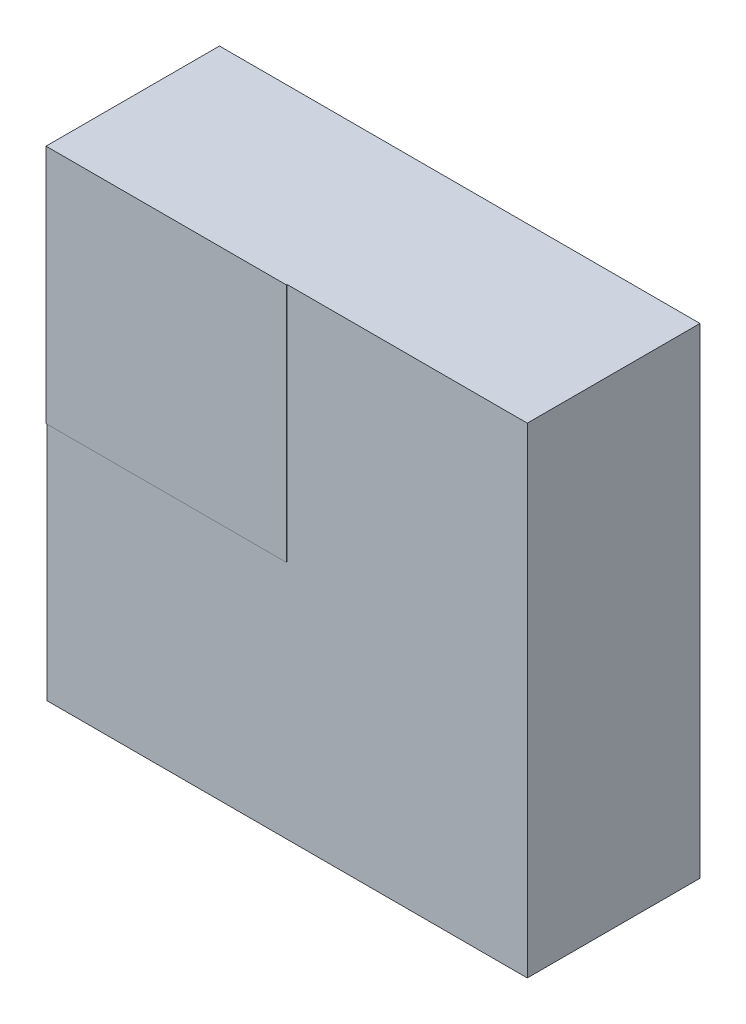
ISO-10303-21;
HEADER;
FILE_DESCRIPTION(('STEP AP214'),'2;1');
FILE_NAME('part.step','',(''),(''),'','','');
FILE_SCHEMA(('AUTOMOTIVE_DESIGN { 1 0 10303 214 1 1 1 1 }'));
ENDSEC;
DATA;
#1=APPLICATION_CONTEXT('core data for automotive mechanical design processes');
#2=APPLICATION_PROTOCOL_DEFINITION('international standard','automotive_design',2000,#1);
#3=PRODUCT_CONTEXT('',#1,'mechanical');
#4=PRODUCT('Part','Part','',(#3));
#5=PRODUCT_RELATED_PRODUCT_CATEGORY('part','',(#4));
#6=PRODUCT_DEFINITION_FORMATION('','',#4);
#7=PRODUCT_DEFINITION_CONTEXT('part definition',#1,'design');
#8=PRODUCT_DEFINITION('design','',#6,#7);
#9=PRODUCT_DEFINITION_SHAPE('','',#8);
#10=(LENGTH_UNIT() NAMED_UNIT(*) SI_UNIT(.MILLI.,.METRE.));
#11=(NAMED_UNIT(*) PLANE_ANGLE_UNIT() SI_UNIT($,.RADIAN.));
#12=(NAMED_UNIT(*) SI_UNIT($,.STERADIAN.) SOLID_ANGLE_UNIT());
#13=UNCERTAINTY_MEASURE_WITH_UNIT(LENGTH_MEASURE(1.E-05),#10,'distance_accuracy_value','');
#14=(GEOMETRIC_REPRESENTATION_CONTEXT(3) GLOBAL_UNCERTAINTY_ASSIGNED_CONTEXT((#13)) GLOBAL_UNIT_ASSIGNED_CONTEXT((#10,
#11,#12)) REPRESENTATION_CONTEXT('',''));
#15=CARTESIAN_POINT('',(0.,0.,0.));
#16=DIRECTION('',(0.,0.,1.));
#17=DIRECTION('',(1.,0.,0.));
#18=AXIS2_PLACEMENT_3D('',#15,#16,#17);
#19=CARTESIAN_POINT('',(0.,0.,0.23));
#20=DIRECTION('',(0.,0.,-1.));
#21=DIRECTION('',(-1.,0.,0.));
#22=AXIS2_PLACEMENT_3D('',#19,#20,#21);
#23=PLANE('',#22);
#24=DIRECTION('',(0.,1.,0.));
#25=VECTOR('',#24,1.);
#26=CARTESIAN_POINT('',(0.,0.32,0.23));
#27=LINE('',#26,#25);
#28=CARTESIAN_POINT('',(0.,0.,0.23));
#29=VERTEX_POINT('',#28);
#30=CARTESIAN_POINT('',(0.,0.32,0.23));
#31=VERTEX_POINT('',#30);
#32=EDGE_CURVE('E133',#29,#31,#27,.T.);
#33=ORIENTED_EDGE('',*,*,#32,.F.);
#34=DIRECTION('',(1.,0.,0.));
#35=VECTOR('',#34,1.);
#36=CARTESIAN_POINT('',(-0.32,0.,0.23));
#37=LINE('',#36,#35);
#38=CARTESIAN_POINT('',(-0.32,0.,0.23));
#39=VERTEX_POINT('',#38);
#40=EDGE_CURVE('E69',#39,#29,#37,.T.);
#41=ORIENTED_EDGE('',*,*,#40,.F.);
#42=DIRECTION('',(0.,-1.,0.));
#43=VECTOR('',#42,1.);
#44=CARTESIAN_POINT('',(-0.32,-0.32,0.23));
#45=LINE('',#44,#43);
#46=CARTESIAN_POINT('',(-0.32,-0.32,0.23));
#47=VERTEX_POINT('',#46);
#48=EDGE_CURVE('E137',#39,#47,#45,.T.);
#49=ORIENTED_EDGE('',*,*,#48,.T.);
#50=DIRECTION('',(1.,0.,0.));
#51=VECTOR('',#50,1.);
#52=CARTESIAN_POINT('',(-0.32,-0.32,0.23));
#53=LINE('',#52,#51);
#54=CARTESIAN_POINT('',(0.32,-0.32,0.23));
#55=VERTEX_POINT('',#54);
#56=EDGE_CURVE('E158',#47,#55,#53,.T.);
#57=ORIENTED_EDGE('',*,*,#56,.T.);
#58=DIRECTION('',(0.,1.,0.));
#59=VECTOR('',#58,1.);
#60=CARTESIAN_POINT('',(0.32,-0.32,0.23));
#61=LINE('',#60,#59);
#62=CARTESIAN_POINT('',(0.32,0.32,0.23));
#63=VERTEX_POINT('',#62);
#64=EDGE_CURVE('E150',#55,#63,#61,.T.);
#65=ORIENTED_EDGE('',*,*,#64,.T.);
#66=DIRECTION('',(-1.,0.,0.));
#67=VECTOR('',#66,1.);
#68=CARTESIAN_POINT('',(-0.32,0.32,0.23));
#69=LINE('',#68,#67);
#70=EDGE_CURVE('E75',#63,#31,#69,.T.);
#71=ORIENTED_EDGE('',*,*,#70,.T.);
#72=EDGE_LOOP('',(#33,#41,#49,#57,#65,#71));
#73=FACE_BOUND('',#72,.T.);
#74=ADVANCED_FACE('F46',(#73),#23,.F.);
#75=CARTESIAN_POINT('',(0.32,-0.32,0.23));
#76=DIRECTION('',(-1.,0.,0.));
#77=DIRECTION('',(0.,0.,1.));
#78=AXIS2_PLACEMENT_3D('',#75,#76,#77);
#79=PLANE('',#78);
#80=DIRECTION('',(0.,1.,0.));
#81=VECTOR('',#80,1.);
#82=CARTESIAN_POINT('',(0.32,-0.32,0.));
#83=LINE('',#82,#81);
#84=CARTESIAN_POINT('',(0.32,-0.32,0.));
#85=VERTEX_POINT('',#84);
#86=CARTESIAN_POINT('',(0.32,0.32,0.));
#87=VERTEX_POINT('',#86);
#88=EDGE_CURVE('E139',#85,#87,#83,.T.);
#89=ORIENTED_EDGE('',*,*,#88,.T.);
#90=DIRECTION('',(0.,0.,-1.));
#91=VECTOR('',#90,1.);
#92=CARTESIAN_POINT('',(0.32,0.32,0.23));
#93=LINE('',#92,#91);
#94=EDGE_CURVE('E179',#63,#87,#93,.T.);
#95=ORIENTED_EDGE('',*,*,#94,.F.);
#96=ORIENTED_EDGE('',*,*,#64,.F.);
#97=DIRECTION('',(0.,0.,-1.));
#98=VECTOR('',#97,1.);
#99=CARTESIAN_POINT('',(0.32,-0.32,0.23));
#100=LINE('',#99,#98);
#101=EDGE_CURVE('E160',#55,#85,#100,.T.);
#102=ORIENTED_EDGE('',*,*,#101,.T.);
#103=EDGE_LOOP('',(#89,#95,#96,#102));
#104=FACE_BOUND('',#103,.T.);
#105=ADVANCED_FACE('F216',(#104),#79,.F.);
#106=CARTESIAN_POINT('',(-0.32,0.32,0.23));
#107=DIRECTION('',(0.,-1.,0.));
#108=DIRECTION('',(0.,0.,-1.));
#109=AXIS2_PLACEMENT_3D('',#106,#107,#108);
#110=PLANE('',#109);
#111=DIRECTION('',(-1.,0.,0.));
#112=VECTOR('',#111,1.);
#113=CARTESIAN_POINT('',(-0.32,0.32,0.));
#114=LINE('',#113,#112);
#115=CARTESIAN_POINT('',(-0.32,0.32,0.));
#116=VERTEX_POINT('',#115);
#117=EDGE_CURVE('E144',#87,#116,#114,.T.);
#118=ORIENTED_EDGE('',*,*,#117,.T.);
#119=DIRECTION('',(0.,0.,-1.));
#120=VECTOR('',#119,1.);
#121=CARTESIAN_POINT('',(-0.32,0.32,0.23));
#122=LINE('',#121,#120);
#123=CARTESIAN_POINT('',(-0.32,0.32,0.231));
#124=VERTEX_POINT('',#123);
#125=EDGE_CURVE('E176',#124,#116,#122,.T.);
#126=ORIENTED_EDGE('',*,*,#125,.F.);
#127=DIRECTION('',(-1.,0.,0.));
#128=VECTOR('',#127,1.);
#129=CARTESIAN_POINT('',(-0.32,0.32,0.231));
#130=LINE('',#129,#128);
#131=CARTESIAN_POINT('',(0.,0.32,0.231));
#132=VERTEX_POINT('',#131);
#133=EDGE_CURVE('E129',#132,#124,#130,.T.);
#134=ORIENTED_EDGE('',*,*,#133,.F.);
#135=DIRECTION('',(0.,0.,-1.));
#136=VECTOR('',#135,1.);
#137=CARTESIAN_POINT('',(0.,0.32,0.231));
#138=LINE('',#137,#136);
#139=EDGE_CURVE('E146',#132,#31,#138,.T.);
#140=ORIENTED_EDGE('',*,*,#139,.T.);
#141=ORIENTED_EDGE('',*,*,#70,.F.);
#142=ORIENTED_EDGE('',*,*,#94,.T.);
#143=EDGE_LOOP('',(#118,#126,#134,#140,#141,#142));
#144=FACE_BOUND('',#143,.T.);
#145=ADVANCED_FACE('F410',(#144),#110,.F.);
#146=CARTESIAN_POINT('',(-0.32,-0.32,0.23));
#147=DIRECTION('',(1.,0.,0.));
#148=DIRECTION('',(0.,0.,-1.));
#149=AXIS2_PLACEMENT_3D('',#146,#147,#148);
#150=PLANE('',#149);
#151=DIRECTION('',(0.,-1.,0.));
#152=VECTOR('',#151,1.);
#153=CARTESIAN_POINT('',(-0.32,-0.32,0.));
#154=LINE('',#153,#152);
#155=CARTESIAN_POINT('',(-0.32,-0.32,0.));
#156=VERTEX_POINT('',#155);
#157=EDGE_CURVE('E164',#116,#156,#154,.T.);
#158=ORIENTED_EDGE('',*,*,#157,.T.);
#159=DIRECTION('',(0.,0.,-1.));
#160=VECTOR('',#159,1.);
#161=CARTESIAN_POINT('',(-0.32,-0.32,0.23));
#162=LINE('',#161,#160);
#163=EDGE_CURVE('E172',#47,#156,#162,.T.);
#164=ORIENTED_EDGE('',*,*,#163,.F.);
#165=ORIENTED_EDGE('',*,*,#48,.F.);
#166=DIRECTION('',(0.,0.,-1.));
#167=VECTOR('',#166,1.);
#168=CARTESIAN_POINT('',(-0.32,0.,0.231));
#169=LINE('',#168,#167);
#170=CARTESIAN_POINT('',(-0.32,0.,0.231));
#171=VERTEX_POINT('',#170);
#172=EDGE_CURVE('E116',#171,#39,#169,.T.);
#173=ORIENTED_EDGE('',*,*,#172,.F.);
#174=DIRECTION('',(0.,-1.,0.));
#175=VECTOR('',#174,1.);
#176=CARTESIAN_POINT('',(-0.32,0.32,0.231));
#177=LINE('',#176,#175);
#178=EDGE_CURVE('E123',#124,#171,#177,.T.);
#179=ORIENTED_EDGE('',*,*,#178,.F.);
#180=ORIENTED_EDGE('',*,*,#125,.T.);
#181=EDGE_LOOP('',(#158,#164,#165,#173,#179,#180));
#182=FACE_BOUND('',#181,.T.);
#183=ADVANCED_FACE('F135',(#182),#150,.F.);
#184=CARTESIAN_POINT('',(-0.32,-0.32,0.23));
#185=DIRECTION('',(0.,1.,0.));
#186=DIRECTION('',(0.,0.,1.));
#187=AXIS2_PLACEMENT_3D('',#184,#185,#186);
#188=PLANE('',#187);
#189=DIRECTION('',(1.,0.,0.));
#190=VECTOR('',#189,1.);
#191=CARTESIAN_POINT('',(-0.32,-0.32,0.));
#192=LINE('',#191,#190);
#193=EDGE_CURVE('E153',#156,#85,#192,.T.);
#194=ORIENTED_EDGE('',*,*,#193,.T.);
#195=ORIENTED_EDGE('',*,*,#101,.F.);
#196=ORIENTED_EDGE('',*,*,#56,.F.);
#197=ORIENTED_EDGE('',*,*,#163,.T.);
#198=EDGE_LOOP('',(#194,#195,#196,#197));
#199=FACE_BOUND('',#198,.T.);
#200=ADVANCED_FACE('F220',(#199),#188,.F.);
#201=CARTESIAN_POINT('',(0.,0.,0.));
#202=DIRECTION('',(0.,0.,-1.));
#203=DIRECTION('',(-1.,0.,0.));
#204=AXIS2_PLACEMENT_3D('',#201,#202,#203);
#205=PLANE('',#204);
#206=CARTESIAN_POINT('',(-0.28,-0.175,0.));
#207=CARTESIAN_POINT('',(-0.28,-0.147542614207743,0.));
#208=CARTESIAN_POINT('',(-0.268661515711948,-0.120169091662773,0.));
#209=CARTESIAN_POINT('',(-0.229830908337227,-0.0813384842880517,0.));
#210=CARTESIAN_POINT('',(-0.202457385792258,-0.07,0.));
#211=CARTESIAN_POINT('',(-0.147542614207742,-0.07,0.));
#212=CARTESIAN_POINT('',(-0.120169091662773,-0.0813384842880522,0.));
#213=CARTESIAN_POINT('',(-0.0813384842880523,-0.120169091662773,0.));
#214=CARTESIAN_POINT('',(-0.07,-0.147542614207742,0.));
#215=CARTESIAN_POINT('',(-0.07,-0.202457385792258,0.));
#216=CARTESIAN_POINT('',(-0.0813384842880521,-0.229830908337227,0.));
#217=CARTESIAN_POINT('',(-0.120169091662773,-0.268661515711948,0.));
#218=CARTESIAN_POINT('',(-0.147542614207743,-0.28,0.));
#219=CARTESIAN_POINT('',(-0.202457385792257,-0.28,0.));
#220=CARTESIAN_POINT('',(-0.229830908337227,-0.268661515711948,0.));
#221=CARTESIAN_POINT('',(-0.268661515711948,-0.229830908337227,0.));
#222=CARTESIAN_POINT('',(-0.28,-0.202457385792257,0.));
#223=CARTESIAN_POINT('',(-0.28,-0.175,0.));
#224=(BOUNDED_CURVE() B_SPLINE_CURVE(3,(#206,#207,#208,#209,#210,#211,#212,#213,#214,#215,#216,
#217,#218,#219,#220,#221,#222,#223),.UNSPECIFIED.,.T.,.F.) B_SPLINE_CURVE_WITH_KNOTS((4,2,2,2,2,
2,2,2,4),(-3.14159265358979,-2.35619449019234,-1.5707963267949,-0.785398163397448,0.,
0.785398163397448,1.5707963267949,2.35619449019234,3.14159265358979),
.UNSPECIFIED.) CURVE() GEOMETRIC_REPRESENTATION_ITEM() RATIONAL_B_SPLINE_CURVE((1.,1.,1.,1.,1.,
1.,1.,1.,1.,1.,1.,1.,1.,1.,1.,1.,1.,1.)) REPRESENTATION_ITEM(''));
#225=CARTESIAN_POINT('',(-0.28,-0.175,0.));
#226=VERTEX_POINT('',#225);
#227=EDGE_CURVE('E12',#226,#226,#224,.T.);
#228=ORIENTED_EDGE('',*,*,#227,.F.);
#229=EDGE_LOOP('',(#228));
#230=FACE_BOUND('',#229,.T.);
#231=CARTESIAN_POINT('',(0.07,-0.175,0.));
#232=CARTESIAN_POINT('',(0.07,-0.147542614207743,0.));
#233=CARTESIAN_POINT('',(0.0813384842880518,-0.120169091662773,0.));
#234=CARTESIAN_POINT('',(0.120169091662773,-0.0813384842880517,0.));
#235=CARTESIAN_POINT('',(0.147542614207742,-0.07,0.));
#236=CARTESIAN_POINT('',(0.202457385792258,-0.07,0.));
#237=CARTESIAN_POINT('',(0.229830908337227,-0.0813384842880522,0.));
#238=CARTESIAN_POINT('',(0.268661515711948,-0.120169091662773,0.));
#239=CARTESIAN_POINT('',(0.28,-0.147542614207742,0.));
#240=CARTESIAN_POINT('',(0.28,-0.202457385792258,0.));
#241=CARTESIAN_POINT('',(0.268661515711948,-0.229830908337227,0.));
#242=CARTESIAN_POINT('',(0.229830908337227,-0.268661515711948,0.));
#243=CARTESIAN_POINT('',(0.202457385792257,-0.28,0.));
#244=CARTESIAN_POINT('',(0.147542614207743,-0.28,0.));
#245=CARTESIAN_POINT('',(0.120169091662773,-0.268661515711948,0.));
#246=CARTESIAN_POINT('',(0.0813384842880516,-0.229830908337227,0.));
#247=CARTESIAN_POINT('',(0.07,-0.202457385792257,0.));
#248=CARTESIAN_POINT('',(0.07,-0.175,0.));
#249=(BOUNDED_CURVE() B_SPLINE_CURVE(3,(#231,#232,#233,#234,#235,#236,#237,#238,#239,#240,#241,
#242,#243,#244,#245,#246,#247,#248),.UNSPECIFIED.,.T.,.F.) B_SPLINE_CURVE_WITH_KNOTS((4,2,2,2,2,
2,2,2,4),(-3.14159265358979,-2.35619449019234,-1.5707963267949,-0.785398163397448,0.,
0.785398163397448,1.5707963267949,2.35619449019234,3.14159265358979),
.UNSPECIFIED.) CURVE() GEOMETRIC_REPRESENTATION_ITEM() RATIONAL_B_SPLINE_CURVE((1.,1.,1.,1.,1.,
1.,1.,1.,1.,1.,1.,1.,1.,1.,1.,1.,1.,1.)) REPRESENTATION_ITEM(''));
#250=CARTESIAN_POINT('',(0.07,-0.175,0.));
#251=VERTEX_POINT('',#250);
#252=EDGE_CURVE('E62',#251,#251,#249,.T.);
#253=ORIENTED_EDGE('',*,*,#252,.F.);
#254=EDGE_LOOP('',(#253));
#255=FACE_BOUND('',#254,.T.);
#256=CARTESIAN_POINT('',(-0.28,0.175,0.));
#257=CARTESIAN_POINT('',(-0.28,0.202457385792257,0.));
#258=CARTESIAN_POINT('',(-0.268661515711948,0.229830908337227,0.));
#259=CARTESIAN_POINT('',(-0.229830908337227,0.268661515711948,0.));
#260=CARTESIAN_POINT('',(-0.202457385792258,0.28,0.));
#261=CARTESIAN_POINT('',(-0.147542614207742,0.28,0.));
#262=CARTESIAN_POINT('',(-0.120169091662773,0.268661515711948,0.));
#263=CARTESIAN_POINT('',(-0.0813384842880523,0.229830908337227,0.));
#264=CARTESIAN_POINT('',(-0.07,0.202457385792258,0.));
#265=CARTESIAN_POINT('',(-0.07,0.147542614207742,0.));
#266=CARTESIAN_POINT('',(-0.0813384842880521,0.120169091662773,0.));
#267=CARTESIAN_POINT('',(-0.120169091662773,0.0813384842880518,0.));
#268=CARTESIAN_POINT('',(-0.147542614207743,0.0700000000000001,0.));
#269=CARTESIAN_POINT('',(-0.202457385792257,0.07,0.));
#270=CARTESIAN_POINT('',(-0.229830908337227,0.0813384842880518,0.));
#271=CARTESIAN_POINT('',(-0.268661515711948,0.120169091662773,0.));
#272=CARTESIAN_POINT('',(-0.28,0.147542614207743,0.));
#273=CARTESIAN_POINT('',(-0.28,0.175,0.));
#274=(BOUNDED_CURVE() B_SPLINE_CURVE(3,(#256,#257,#258,#259,#260,#261,#262,#263,#264,#265,#266,
#267,#268,#269,#270,#271,#272,#273),.UNSPECIFIED.,.T.,.F.) B_SPLINE_CURVE_WITH_KNOTS((4,2,2,2,2,
2,2,2,4),(-3.14159265358979,-2.35619449019234,-1.5707963267949,-0.785398163397448,0.,
0.785398163397448,1.5707963267949,2.35619449019234,3.14159265358979),
.UNSPECIFIED.) CURVE() GEOMETRIC_REPRESENTATION_ITEM() RATIONAL_B_SPLINE_CURVE((1.,1.,1.,1.,1.,
1.,1.,1.,1.,1.,1.,1.,1.,1.,1.,1.,1.,1.)) REPRESENTATION_ITEM(''));
#275=CARTESIAN_POINT('',(-0.28,0.175,0.));
#276=VERTEX_POINT('',#275);
#277=EDGE_CURVE('E354',#276,#276,#274,.T.);
#278=ORIENTED_EDGE('',*,*,#277,.F.);
#279=EDGE_LOOP('',(#278));
#280=FACE_BOUND('',#279,.T.);
#281=CARTESIAN_POINT('',(0.07,0.175,0.));
#282=CARTESIAN_POINT('',(0.07,0.202457385792257,0.));
#283=CARTESIAN_POINT('',(0.0813384842880518,0.229830908337227,0.));
#284=CARTESIAN_POINT('',(0.120169091662773,0.268661515711948,0.));
#285=CARTESIAN_POINT('',(0.147542614207742,0.28,0.));
#286=CARTESIAN_POINT('',(0.202457385792258,0.28,0.));
#287=CARTESIAN_POINT('',(0.229830908337227,0.268661515711948,0.));
#288=CARTESIAN_POINT('',(0.268661515711948,0.229830908337227,0.));
#289=CARTESIAN_POINT('',(0.28,0.202457385792258,0.));
#290=CARTESIAN_POINT('',(0.28,0.147542614207742,0.));
#291=CARTESIAN_POINT('',(0.268661515711948,0.120169091662773,0.));
#292=CARTESIAN_POINT('',(0.229830908337227,0.0813384842880518,0.));
#293=CARTESIAN_POINT('',(0.202457385792257,0.0700000000000001,0.));
#294=CARTESIAN_POINT('',(0.147542614207743,0.07,0.));
#295=CARTESIAN_POINT('',(0.120169091662773,0.0813384842880518,0.));
#296=CARTESIAN_POINT('',(0.0813384842880516,0.120169091662773,0.));
#297=CARTESIAN_POINT('',(0.07,0.147542614207743,0.));
#298=CARTESIAN_POINT('',(0.07,0.175,0.));
#299=(BOUNDED_CURVE() B_SPLINE_CURVE(3,(#281,#282,#283,#284,#285,#286,#287,#288,#289,#290,#291,
#292,#293,#294,#295,#296,#297,#298),.UNSPECIFIED.,.T.,.F.) B_SPLINE_CURVE_WITH_KNOTS((4,2,2,2,2,
2,2,2,4),(-3.14159265358979,-2.35619449019234,-1.5707963267949,-0.785398163397448,0.,
0.785398163397448,1.5707963267949,2.35619449019234,3.14159265358979),
.UNSPECIFIED.) CURVE() GEOMETRIC_REPRESENTATION_ITEM() RATIONAL_B_SPLINE_CURVE((1.,1.,1.,1.,1.,
1.,1.,1.,1.,1.,1.,1.,1.,1.,1.,1.,1.,1.)) REPRESENTATION_ITEM(''));
#300=CARTESIAN_POINT('',(0.07,0.175,0.));
#301=VERTEX_POINT('',#300);
#302=EDGE_CURVE('E404',#301,#301,#299,.T.);
#303=ORIENTED_EDGE('',*,*,#302,.F.);
#304=EDGE_LOOP('',(#303));
#305=FACE_BOUND('',#304,.T.);
#306=ORIENTED_EDGE('',*,*,#88,.F.);
#307=ORIENTED_EDGE('',*,*,#193,.F.);
#308=ORIENTED_EDGE('',*,*,#157,.F.);
#309=ORIENTED_EDGE('',*,*,#117,.F.);
#310=EDGE_LOOP('',(#306,#307,#308,#309));
#311=FACE_BOUND('',#310,.T.);
#312=ADVANCED_FACE('F214',(#230,#255,#280,#305,#311),#205,.T.);
#313=CARTESIAN_POINT('',(-0.32,0.,0.231));
#314=DIRECTION('',(0.,1.,0.));
#315=DIRECTION('',(0.,0.,1.));
#316=AXIS2_PLACEMENT_3D('',#313,#314,#315);
#317=PLANE('',#316);
#318=ORIENTED_EDGE('',*,*,#40,.T.);
#319=DIRECTION('',(0.,0.,-1.));
#320=VECTOR('',#319,1.);
#321=CARTESIAN_POINT('',(0.,0.,0.231));
#322=LINE('',#321,#320);
#323=CARTESIAN_POINT('',(0.,0.,0.231));
#324=VERTEX_POINT('',#323);
#325=EDGE_CURVE('E118',#324,#29,#322,.T.);
#326=ORIENTED_EDGE('',*,*,#325,.F.);
#327=DIRECTION('',(1.,0.,0.));
#328=VECTOR('',#327,1.);
#329=CARTESIAN_POINT('',(-0.32,0.,0.231));
#330=LINE('',#329,#328);
#331=EDGE_CURVE('E112',#171,#324,#330,.T.);
#332=ORIENTED_EDGE('',*,*,#331,.F.);
#333=ORIENTED_EDGE('',*,*,#172,.T.);
#334=EDGE_LOOP('',(#318,#326,#332,#333));
#335=FACE_BOUND('',#334,.T.);
#336=ADVANCED_FACE('F114',(#335),#317,.F.);
#337=CARTESIAN_POINT('',(0.,0.32,0.231));
#338=DIRECTION('',(-1.,0.,0.));
#339=DIRECTION('',(0.,0.,1.));
#340=AXIS2_PLACEMENT_3D('',#337,#338,#339);
#341=PLANE('',#340);
#342=ORIENTED_EDGE('',*,*,#32,.T.);
#343=ORIENTED_EDGE('',*,*,#139,.F.);
#344=DIRECTION('',(0.,1.,0.));
#345=VECTOR('',#344,1.);
#346=CARTESIAN_POINT('',(0.,0.32,0.231));
#347=LINE('',#346,#345);
#348=EDGE_CURVE('E122',#324,#132,#347,.T.);
#349=ORIENTED_EDGE('',*,*,#348,.F.);
#350=ORIENTED_EDGE('',*,*,#325,.T.);
#351=EDGE_LOOP('',(#342,#343,#349,#350));
#352=FACE_BOUND('',#351,.T.);
#353=ADVANCED_FACE('F208',(#352),#341,.F.);
#354=CARTESIAN_POINT('',(0.,0.,0.231));
#355=DIRECTION('',(0.,0.,1.));
#356=DIRECTION('',(1.,0.,0.));
#357=AXIS2_PLACEMENT_3D('',#354,#355,#356);
#358=PLANE('',#357);
#359=ORIENTED_EDGE('',*,*,#178,.T.);
#360=ORIENTED_EDGE('',*,*,#331,.T.);
#361=ORIENTED_EDGE('',*,*,#348,.T.);
#362=ORIENTED_EDGE('',*,*,#133,.T.);
#363=EDGE_LOOP('',(#359,#360,#361,#362));
#364=FACE_BOUND('',#363,.T.);
#365=ADVANCED_FACE('F127',(#364),#358,.T.);
#366=CARTESIAN_POINT('',(0.175,0.175,-0.06));
#367=DIRECTION('',(0.,0.,-1.));
#368=DIRECTION('',(-1.,0.,0.));
#369=AXIS2_PLACEMENT_3D('',#366,#367,#368);
#370=PLANE('',#369);
#371=CARTESIAN_POINT('',(0.162951600308978,0.175,-0.06));
#372=CARTESIAN_POINT('',(0.162951600308978,0.171849356585755,-0.06));
#373=CARTESIAN_POINT('',(0.164252653552719,0.168708336199346,-0.06));
#374=CARTESIAN_POINT('',(0.168708336199346,0.164252653552719,-0.06));
#375=CARTESIAN_POINT('',(0.171849356585755,0.162951600308978,-0.06));
#376=CARTESIAN_POINT('',(0.178150643414245,0.162951600308978,-0.06));
#377=CARTESIAN_POINT('',(0.181291663800654,0.164252653552719,-0.06));
#378=CARTESIAN_POINT('',(0.185747346447281,0.168708336199346,-0.06));
#379=CARTESIAN_POINT('',(0.187048399691022,0.171849356585755,-0.06));
#380=CARTESIAN_POINT('',(0.187048399691022,0.178150643414245,-0.06));
#381=CARTESIAN_POINT('',(0.185747346447281,0.181291663800654,-0.06));
#382=CARTESIAN_POINT('',(0.181291663800654,0.185747346447281,-0.06));
#383=CARTESIAN_POINT('',(0.178150643414245,0.187048399691022,-0.06));
#384=CARTESIAN_POINT('',(0.171849356585755,0.187048399691022,-0.06));
#385=CARTESIAN_POINT('',(0.168708336199346,0.185747346447281,-0.06));
#386=CARTESIAN_POINT('',(0.164252653552719,0.181291663800654,-0.06));
#387=CARTESIAN_POINT('',(0.162951600308978,0.178150643414245,-0.06));
#388=CARTESIAN_POINT('',(0.162951600308978,0.175,-0.06));
#389=(BOUNDED_CURVE() B_SPLINE_CURVE(3,(#371,#372,#373,#374,#375,#376,#377,#378,#379,#380,#381,
#382,#383,#384,#385,#386,#387,#388),.UNSPECIFIED.,.T.,.F.) B_SPLINE_CURVE_WITH_KNOTS((4,2,2,2,2,
2,2,2,4),(-3.14159265358979,-2.35619449019234,-1.5707963267949,-0.785398163397448,0.,
0.785398163397448,1.5707963267949,2.35619449019234,3.14159265358979),
.UNSPECIFIED.) CURVE() GEOMETRIC_REPRESENTATION_ITEM() RATIONAL_B_SPLINE_CURVE((1.,1.,1.,1.,1.,
1.,1.,1.,1.,1.,1.,1.,1.,1.,1.,1.,1.,1.)) REPRESENTATION_ITEM(''));
#390=CARTESIAN_POINT('',(0.162951600308978,0.175,-0.06));
#391=VERTEX_POINT('',#390);
#392=EDGE_CURVE('E183',#391,#391,#389,.F.);
#393=ORIENTED_EDGE('',*,*,#392,.T.);
#394=EDGE_LOOP('',(#393));
#395=FACE_BOUND('',#394,.T.);
#396=ADVANCED_FACE('F193',(#395),#370,.T.);
#397=CARTESIAN_POINT('',(0.07,0.175,0.));
#398=CARTESIAN_POINT('',(0.07,0.147542614207743,0.));
#399=CARTESIAN_POINT('',(0.0813384842880516,0.120169091662773,0.));
#400=CARTESIAN_POINT('',(0.120169091662773,0.0813384842880518,0.));
#401=CARTESIAN_POINT('',(0.147542614207743,0.07,0.));
#402=CARTESIAN_POINT('',(0.202457385792257,0.0700000000000001,0.));
#403=CARTESIAN_POINT('',(0.229830908337227,0.0813384842880518,0.));
#404=CARTESIAN_POINT('',(0.268661515711948,0.120169091662773,0.));
#405=CARTESIAN_POINT('',(0.28,0.147542614207742,0.));
#406=CARTESIAN_POINT('',(0.28,0.202457385792258,0.));
#407=CARTESIAN_POINT('',(0.268661515711948,0.229830908337227,0.));
#408=CARTESIAN_POINT('',(0.229830908337227,0.268661515711948,0.));
#409=CARTESIAN_POINT('',(0.202457385792258,0.28,0.));
#410=CARTESIAN_POINT('',(0.147542614207742,0.28,0.));
#411=CARTESIAN_POINT('',(0.120169091662773,0.268661515711948,0.));
#412=CARTESIAN_POINT('',(0.0813384842880518,0.229830908337227,0.));
#413=CARTESIAN_POINT('',(0.07,0.202457385792257,0.));
#414=CARTESIAN_POINT('',(0.07,0.175,0.));
#415=CARTESIAN_POINT('',(0.0971108834234519,0.175,-0.06));
#416=CARTESIAN_POINT('',(0.0971108834234519,0.154632080734663,-0.06));
#417=CARTESIAN_POINT('',(0.105521783656913,0.134326371319274,-0.06));
#418=CARTESIAN_POINT('',(0.134326371319274,0.105521783656913,-0.06));
#419=CARTESIAN_POINT('',(0.154632080734663,0.0971108834234519,-0.06));
#420=CARTESIAN_POINT('',(0.195367919265337,0.097110883423452,-0.06));
#421=CARTESIAN_POINT('',(0.215673628680726,0.105521783656913,-0.06));
#422=CARTESIAN_POINT('',(0.244478216343087,0.134326371319273,-0.06));
#423=CARTESIAN_POINT('',(0.252889116576548,0.154632080734663,-0.06));
#424=CARTESIAN_POINT('',(0.252889116576548,0.195367919265337,-0.06));
#425=CARTESIAN_POINT('',(0.244478216343087,0.215673628680727,-0.06));
#426=CARTESIAN_POINT('',(0.215673628680727,0.244478216343087,-0.06));
#427=CARTESIAN_POINT('',(0.195367919265337,0.252889116576548,-0.06));
#428=CARTESIAN_POINT('',(0.154632080734663,0.252889116576548,-0.06));
#429=CARTESIAN_POINT('',(0.134326371319274,0.244478216343087,-0.06));
#430=CARTESIAN_POINT('',(0.105521783656913,0.215673628680726,-0.06));
#431=CARTESIAN_POINT('',(0.0971108834234519,0.195367919265337,-0.06));
#432=CARTESIAN_POINT('',(0.0971108834234519,0.175,-0.06));
#433=CARTESIAN_POINT('',(0.162951600308978,0.175,-0.06));
#434=CARTESIAN_POINT('',(0.162951600308978,0.171849356585755,-0.06));
#435=CARTESIAN_POINT('',(0.164252653552719,0.168708336199346,-0.06));
#436=CARTESIAN_POINT('',(0.168708336199346,0.164252653552719,-0.06));
#437=CARTESIAN_POINT('',(0.171849356585755,0.162951600308978,-0.06));
#438=CARTESIAN_POINT('',(0.178150643414245,0.162951600308978,-0.06));
#439=CARTESIAN_POINT('',(0.181291663800654,0.164252653552719,-0.06));
#440=CARTESIAN_POINT('',(0.185747346447281,0.168708336199346,-0.06));
#441=CARTESIAN_POINT('',(0.187048399691022,0.171849356585755,-0.06));
#442=CARTESIAN_POINT('',(0.187048399691022,0.178150643414245,-0.06));
#443=CARTESIAN_POINT('',(0.185747346447281,0.181291663800654,-0.06));
#444=CARTESIAN_POINT('',(0.181291663800654,0.185747346447281,-0.06));
#445=CARTESIAN_POINT('',(0.178150643414245,0.187048399691022,-0.06));
#446=CARTESIAN_POINT('',(0.171849356585755,0.187048399691022,-0.06));
#447=CARTESIAN_POINT('',(0.168708336199346,0.185747346447281,-0.06));
#448=CARTESIAN_POINT('',(0.164252653552719,0.181291663800654,-0.06));
#449=CARTESIAN_POINT('',(0.162951600308978,0.178150643414245,-0.06));
#450=CARTESIAN_POINT('',(0.162951600308978,0.175,-0.06));
#451=(BOUNDED_SURFACE() B_SPLINE_SURFACE(2,3,((#397,#398,#399,#400,#401,#402,#403,#404,#405,
#406,#407,#408,#409,#410,#411,#412,#413,#414),(#415,#416,#417,#418,#419,#420,#421,#422,#423,
#424,#425,#426,#427,#428,#429,#430,#431,#432),(#433,#434,#435,#436,#437,#438,#439,#440,#441,
#442,#443,#444,#445,#446,#447,#448,#449,#450)),.UNSPECIFIED.,.F.,.T.,
.F.) B_SPLINE_SURFACE_WITH_KNOTS((3,3),(4,2,2,2,2,2,2,2,4),(0.,1.),(-3.14159265358979,
-2.35619449019234,-1.5707963267949,-0.785398163397448,0.,0.785398163397448,1.5707963267949,
2.35619449019234,3.14159265358979),
.UNSPECIFIED.) GEOMETRIC_REPRESENTATION_ITEM() RATIONAL_B_SPLINE_SURFACE(((1.,1.,1.,1.,1.,1.,1.,
1.,1.,1.,1.,1.,1.,1.,1.,1.,1.,1.),(1.,1.,1.,1.,1.,1.,1.,1.,1.,1.,1.,1.,1.,1.,1.,1.,1.,1.),(1.,
1.,1.,1.,1.,1.,1.,1.,1.,1.,1.,1.,1.,1.,1.,1.,1.,1.))) REPRESENTATION_ITEM('') SURFACE());
#452=ORIENTED_EDGE('',*,*,#302,.T.);
#453=EDGE_LOOP('',(#452));
#454=FACE_BOUND('',#453,.T.);
#455=ORIENTED_EDGE('',*,*,#392,.F.);
#456=EDGE_LOOP('',(#455));
#457=FACE_BOUND('',#456,.T.);
#458=ADVANCED_FACE('F49',(#454,#457),#451,.T.);
#459=CARTESIAN_POINT('',(-0.175,0.175,-0.06));
#460=DIRECTION('',(0.,0.,-1.));
#461=DIRECTION('',(-1.,0.,0.));
#462=AXIS2_PLACEMENT_3D('',#459,#460,#461);
#463=PLANE('',#462);
#464=CARTESIAN_POINT('',(-0.187048399691022,0.175,-0.06));
#465=CARTESIAN_POINT('',(-0.187048399691022,0.171849356585755,-0.06));
#466=CARTESIAN_POINT('',(-0.185747346447281,0.168708336199346,-0.06));
#467=CARTESIAN_POINT('',(-0.181291663800654,0.164252653552719,-0.06));
#468=CARTESIAN_POINT('',(-0.178150643414245,0.162951600308978,-0.06));
#469=CARTESIAN_POINT('',(-0.171849356585755,0.162951600308978,-0.06));
#470=CARTESIAN_POINT('',(-0.168708336199346,0.164252653552719,-0.06));
#471=CARTESIAN_POINT('',(-0.164252653552719,0.168708336199346,-0.06));
#472=CARTESIAN_POINT('',(-0.162951600308978,0.171849356585755,-0.06));
#473=CARTESIAN_POINT('',(-0.162951600308978,0.178150643414245,-0.06));
#474=CARTESIAN_POINT('',(-0.164252653552719,0.181291663800654,-0.06));
#475=CARTESIAN_POINT('',(-0.168708336199346,0.185747346447281,-0.06));
#476=CARTESIAN_POINT('',(-0.171849356585755,0.187048399691022,-0.06));
#477=CARTESIAN_POINT('',(-0.178150643414245,0.187048399691022,-0.06));
#478=CARTESIAN_POINT('',(-0.181291663800654,0.185747346447281,-0.06));
#479=CARTESIAN_POINT('',(-0.185747346447281,0.181291663800654,-0.06));
#480=CARTESIAN_POINT('',(-0.187048399691022,0.178150643414245,-0.06));
#481=CARTESIAN_POINT('',(-0.187048399691022,0.175,-0.06));
#482=(BOUNDED_CURVE() B_SPLINE_CURVE(3,(#464,#465,#466,#467,#468,#469,#470,#471,#472,#473,#474,
#475,#476,#477,#478,#479,#480,#481),.UNSPECIFIED.,.T.,.F.) B_SPLINE_CURVE_WITH_KNOTS((4,2,2,2,2,
2,2,2,4),(-3.14159265358979,-2.35619449019234,-1.5707963267949,-0.785398163397448,0.,
0.785398163397448,1.5707963267949,2.35619449019234,3.14159265358979),
.UNSPECIFIED.) CURVE() GEOMETRIC_REPRESENTATION_ITEM() RATIONAL_B_SPLINE_CURVE((1.,1.,1.,1.,1.,
1.,1.,1.,1.,1.,1.,1.,1.,1.,1.,1.,1.,1.)) REPRESENTATION_ITEM(''));
#483=CARTESIAN_POINT('',(-0.187048399691022,0.175,-0.06));
#484=VERTEX_POINT('',#483);
#485=EDGE_CURVE('E389',#484,#484,#482,.F.);
#486=ORIENTED_EDGE('',*,*,#485,.T.);
#487=EDGE_LOOP('',(#486));
#488=FACE_BOUND('',#487,.T.);
#489=ADVANCED_FACE('F203',(#488),#463,.T.);
#490=CARTESIAN_POINT('',(-0.28,0.175,0.));
#491=CARTESIAN_POINT('',(-0.28,0.147542614207743,0.));
#492=CARTESIAN_POINT('',(-0.268661515711948,0.120169091662773,0.));
#493=CARTESIAN_POINT('',(-0.229830908337227,0.0813384842880518,0.));
#494=CARTESIAN_POINT('',(-0.202457385792257,0.07,0.));
#495=CARTESIAN_POINT('',(-0.147542614207743,0.0700000000000001,0.));
#496=CARTESIAN_POINT('',(-0.120169091662773,0.0813384842880518,0.));
#497=CARTESIAN_POINT('',(-0.0813384842880521,0.120169091662773,0.));
#498=CARTESIAN_POINT('',(-0.07,0.147542614207742,0.));
#499=CARTESIAN_POINT('',(-0.07,0.202457385792258,0.));
#500=CARTESIAN_POINT('',(-0.0813384842880523,0.229830908337227,0.));
#501=CARTESIAN_POINT('',(-0.120169091662773,0.268661515711948,0.));
#502=CARTESIAN_POINT('',(-0.147542614207742,0.28,0.));
#503=CARTESIAN_POINT('',(-0.202457385792258,0.28,0.));
#504=CARTESIAN_POINT('',(-0.229830908337227,0.268661515711948,0.));
#505=CARTESIAN_POINT('',(-0.268661515711948,0.229830908337227,0.));
#506=CARTESIAN_POINT('',(-0.28,0.202457385792257,0.));
#507=CARTESIAN_POINT('',(-0.28,0.175,0.));
#508=CARTESIAN_POINT('',(-0.252889116576548,0.175,-0.06));
#509=CARTESIAN_POINT('',(-0.252889116576548,0.154632080734663,-0.06));
#510=CARTESIAN_POINT('',(-0.244478216343087,0.134326371319274,-0.06));
#511=CARTESIAN_POINT('',(-0.215673628680726,0.105521783656913,-0.06));
#512=CARTESIAN_POINT('',(-0.195367919265337,0.0971108834234519,-0.06));
#513=CARTESIAN_POINT('',(-0.154632080734663,0.097110883423452,-0.06));
#514=CARTESIAN_POINT('',(-0.134326371319274,0.105521783656913,-0.06));
#515=CARTESIAN_POINT('',(-0.105521783656913,0.134326371319273,-0.06));
#516=CARTESIAN_POINT('',(-0.0971108834234519,0.154632080734663,-0.06));
#517=CARTESIAN_POINT('',(-0.0971108834234519,0.195367919265337,-0.06));
#518=CARTESIAN_POINT('',(-0.105521783656913,0.215673628680727,-0.06));
#519=CARTESIAN_POINT('',(-0.134326371319273,0.244478216343087,-0.06));
#520=CARTESIAN_POINT('',(-0.154632080734663,0.252889116576548,-0.06));
#521=CARTESIAN_POINT('',(-0.195367919265337,0.252889116576548,-0.06));
#522=CARTESIAN_POINT('',(-0.215673628680726,0.244478216343087,-0.06));
#523=CARTESIAN_POINT('',(-0.244478216343087,0.215673628680726,-0.06));
#524=CARTESIAN_POINT('',(-0.252889116576548,0.195367919265337,-0.06));
#525=CARTESIAN_POINT('',(-0.252889116576548,0.175,-0.06));
#526=CARTESIAN_POINT('',(-0.187048399691022,0.175,-0.06));
#527=CARTESIAN_POINT('',(-0.187048399691022,0.171849356585755,-0.06));
#528=CARTESIAN_POINT('',(-0.185747346447281,0.168708336199346,-0.06));
#529=CARTESIAN_POINT('',(-0.181291663800654,0.164252653552719,-0.06));
#530=CARTESIAN_POINT('',(-0.178150643414245,0.162951600308978,-0.06));
#531=CARTESIAN_POINT('',(-0.171849356585755,0.162951600308978,-0.06));
#532=CARTESIAN_POINT('',(-0.168708336199346,0.164252653552719,-0.06));
#533=CARTESIAN_POINT('',(-0.164252653552719,0.168708336199346,-0.06));
#534=CARTESIAN_POINT('',(-0.162951600308978,0.171849356585755,-0.06));
#535=CARTESIAN_POINT('',(-0.162951600308978,0.178150643414245,-0.06));
#536=CARTESIAN_POINT('',(-0.164252653552719,0.181291663800654,-0.06));
#537=CARTESIAN_POINT('',(-0.168708336199346,0.185747346447281,-0.06));
#538=CARTESIAN_POINT('',(-0.171849356585755,0.187048399691022,-0.06));
#539=CARTESIAN_POINT('',(-0.178150643414245,0.187048399691022,-0.06));
#540=CARTESIAN_POINT('',(-0.181291663800654,0.185747346447281,-0.06));
#541=CARTESIAN_POINT('',(-0.185747346447281,0.181291663800654,-0.06));
#542=CARTESIAN_POINT('',(-0.187048399691022,0.178150643414245,-0.06));
#543=CARTESIAN_POINT('',(-0.187048399691022,0.175,-0.06));
#544=(BOUNDED_SURFACE() B_SPLINE_SURFACE(2,3,((#490,#491,#492,#493,#494,#495,#496,#497,#498,
#499,#500,#501,#502,#503,#504,#505,#506,#507),(#508,#509,#510,#511,#512,#513,#514,#515,#516,
#517,#518,#519,#520,#521,#522,#523,#524,#525),(#526,#527,#528,#529,#530,#531,#532,#533,#534,
#535,#536,#537,#538,#539,#540,#541,#542,#543)),.UNSPECIFIED.,.F.,.T.,
.F.) B_SPLINE_SURFACE_WITH_KNOTS((3,3),(4,2,2,2,2,2,2,2,4),(0.,1.),(-3.14159265358979,
-2.35619449019234,-1.5707963267949,-0.785398163397448,0.,0.785398163397448,1.5707963267949,
2.35619449019234,3.14159265358979),
.UNSPECIFIED.) GEOMETRIC_REPRESENTATION_ITEM() RATIONAL_B_SPLINE_SURFACE(((1.,1.,1.,1.,1.,1.,1.,
1.,1.,1.,1.,1.,1.,1.,1.,1.,1.,1.),(1.,1.,1.,1.,1.,1.,1.,1.,1.,1.,1.,1.,1.,1.,1.,1.,1.,1.),(1.,
1.,1.,1.,1.,1.,1.,1.,1.,1.,1.,1.,1.,1.,1.,1.,1.,1.))) REPRESENTATION_ITEM('') SURFACE());
#545=ORIENTED_EDGE('',*,*,#277,.T.);
#546=EDGE_LOOP('',(#545));
#547=FACE_BOUND('',#546,.T.);
#548=ORIENTED_EDGE('',*,*,#485,.F.);
#549=EDGE_LOOP('',(#548));
#550=FACE_BOUND('',#549,.T.);
#551=ADVANCED_FACE('F360',(#547,#550),#544,.T.);
#552=CARTESIAN_POINT('',(0.175,-0.175,-0.06));
#553=DIRECTION('',(0.,0.,-1.));
#554=DIRECTION('',(-1.,0.,0.));
#555=AXIS2_PLACEMENT_3D('',#552,#553,#554);
#556=PLANE('',#555);
#557=CARTESIAN_POINT('',(0.162951600308978,-0.175,-0.06));
#558=CARTESIAN_POINT('',(0.162951600308978,-0.178150643414245,-0.06));
#559=CARTESIAN_POINT('',(0.164252653552719,-0.181291663800654,-0.06));
#560=CARTESIAN_POINT('',(0.168708336199346,-0.185747346447281,-0.06));
#561=CARTESIAN_POINT('',(0.171849356585755,-0.187048399691022,-0.06));
#562=CARTESIAN_POINT('',(0.178150643414245,-0.187048399691022,-0.06));
#563=CARTESIAN_POINT('',(0.181291663800654,-0.185747346447281,-0.06));
#564=CARTESIAN_POINT('',(0.185747346447281,-0.181291663800654,-0.06));
#565=CARTESIAN_POINT('',(0.187048399691022,-0.178150643414245,-0.06));
#566=CARTESIAN_POINT('',(0.187048399691022,-0.171849356585755,-0.06));
#567=CARTESIAN_POINT('',(0.185747346447281,-0.168708336199346,-0.06));
#568=CARTESIAN_POINT('',(0.181291663800654,-0.164252653552719,-0.06));
#569=CARTESIAN_POINT('',(0.178150643414245,-0.162951600308978,-0.06));
#570=CARTESIAN_POINT('',(0.171849356585755,-0.162951600308978,-0.06));
#571=CARTESIAN_POINT('',(0.168708336199346,-0.164252653552719,-0.06));
#572=CARTESIAN_POINT('',(0.164252653552719,-0.168708336199346,-0.06));
#573=CARTESIAN_POINT('',(0.162951600308978,-0.171849356585755,-0.06));
#574=CARTESIAN_POINT('',(0.162951600308978,-0.175,-0.06));
#575=(BOUNDED_CURVE() B_SPLINE_CURVE(3,(#557,#558,#559,#560,#561,#562,#563,#564,#565,#566,#567,
#568,#569,#570,#571,#572,#573,#574),.UNSPECIFIED.,.T.,.F.) B_SPLINE_CURVE_WITH_KNOTS((4,2,2,2,2,
2,2,2,4),(-3.14159265358979,-2.35619449019234,-1.5707963267949,-0.785398163397448,0.,
0.785398163397448,1.5707963267949,2.35619449019234,3.14159265358979),
.UNSPECIFIED.) CURVE() GEOMETRIC_REPRESENTATION_ITEM() RATIONAL_B_SPLINE_CURVE((1.,1.,1.,1.,1.,
1.,1.,1.,1.,1.,1.,1.,1.,1.,1.,1.,1.,1.)) REPRESENTATION_ITEM(''));
#576=CARTESIAN_POINT('',(0.162951600308978,-0.175,-0.06));
#577=VERTEX_POINT('',#576);
#578=EDGE_CURVE('E341',#577,#577,#575,.F.);
#579=ORIENTED_EDGE('',*,*,#578,.T.);
#580=EDGE_LOOP('',(#579));
#581=FACE_BOUND('',#580,.T.);
#582=ADVANCED_FACE('F322',(#581),#556,.T.);
#583=CARTESIAN_POINT('',(0.07,-0.175,0.));
#584=CARTESIAN_POINT('',(0.07,-0.202457385792257,0.));
#585=CARTESIAN_POINT('',(0.0813384842880516,-0.229830908337227,0.));
#586=CARTESIAN_POINT('',(0.120169091662773,-0.268661515711948,0.));
#587=CARTESIAN_POINT('',(0.147542614207743,-0.28,0.));
#588=CARTESIAN_POINT('',(0.202457385792257,-0.28,0.));
#589=CARTESIAN_POINT('',(0.229830908337227,-0.268661515711948,0.));
#590=CARTESIAN_POINT('',(0.268661515711948,-0.229830908337227,0.));
#591=CARTESIAN_POINT('',(0.28,-0.202457385792258,0.));
#592=CARTESIAN_POINT('',(0.28,-0.147542614207742,0.));
#593=CARTESIAN_POINT('',(0.268661515711948,-0.120169091662773,0.));
#594=CARTESIAN_POINT('',(0.229830908337227,-0.0813384842880522,0.));
#595=CARTESIAN_POINT('',(0.202457385792258,-0.07,0.));
#596=CARTESIAN_POINT('',(0.147542614207742,-0.07,0.));
#597=CARTESIAN_POINT('',(0.120169091662773,-0.0813384842880517,0.));
#598=CARTESIAN_POINT('',(0.0813384842880518,-0.120169091662773,0.));
#599=CARTESIAN_POINT('',(0.07,-0.147542614207743,0.));
#600=CARTESIAN_POINT('',(0.07,-0.175,0.));
#601=CARTESIAN_POINT('',(0.0971108834234519,-0.175,-0.06));
#602=CARTESIAN_POINT('',(0.0971108834234519,-0.195367919265337,-0.06));
#603=CARTESIAN_POINT('',(0.105521783656913,-0.215673628680726,-0.06));
#604=CARTESIAN_POINT('',(0.134326371319274,-0.244478216343087,-0.06));
#605=CARTESIAN_POINT('',(0.154632080734663,-0.252889116576548,-0.06));
#606=CARTESIAN_POINT('',(0.195367919265337,-0.252889116576548,-0.06));
#607=CARTESIAN_POINT('',(0.215673628680726,-0.244478216343087,-0.06));
#608=CARTESIAN_POINT('',(0.244478216343087,-0.215673628680727,-0.06));
#609=CARTESIAN_POINT('',(0.252889116576548,-0.195367919265337,-0.06));
#610=CARTESIAN_POINT('',(0.252889116576548,-0.154632080734663,-0.06));
#611=CARTESIAN_POINT('',(0.244478216343087,-0.134326371319273,-0.06));
#612=CARTESIAN_POINT('',(0.215673628680727,-0.105521783656913,-0.06));
#613=CARTESIAN_POINT('',(0.195367919265337,-0.0971108834234519,-0.06));
#614=CARTESIAN_POINT('',(0.154632080734663,-0.0971108834234519,-0.06));
#615=CARTESIAN_POINT('',(0.134326371319274,-0.105521783656913,-0.06));
#616=CARTESIAN_POINT('',(0.105521783656913,-0.134326371319274,-0.06));
#617=CARTESIAN_POINT('',(0.0971108834234519,-0.154632080734663,-0.06));
#618=CARTESIAN_POINT('',(0.0971108834234519,-0.175,-0.06));
#619=CARTESIAN_POINT('',(0.162951600308978,-0.175,-0.06));
#620=CARTESIAN_POINT('',(0.162951600308978,-0.178150643414245,-0.06));
#621=CARTESIAN_POINT('',(0.164252653552719,-0.181291663800654,-0.06));
#622=CARTESIAN_POINT('',(0.168708336199346,-0.185747346447281,-0.06));
#623=CARTESIAN_POINT('',(0.171849356585755,-0.187048399691022,-0.06));
#624=CARTESIAN_POINT('',(0.178150643414245,-0.187048399691022,-0.06));
#625=CARTESIAN_POINT('',(0.181291663800654,-0.185747346447281,-0.06));
#626=CARTESIAN_POINT('',(0.185747346447281,-0.181291663800654,-0.06));
#627=CARTESIAN_POINT('',(0.187048399691022,-0.178150643414245,-0.06));
#628=CARTESIAN_POINT('',(0.187048399691022,-0.171849356585755,-0.06));
#629=CARTESIAN_POINT('',(0.185747346447281,-0.168708336199346,-0.06));
#630=CARTESIAN_POINT('',(0.181291663800654,-0.164252653552719,-0.06));
#631=CARTESIAN_POINT('',(0.178150643414245,-0.162951600308978,-0.06));
#632=CARTESIAN_POINT('',(0.171849356585755,-0.162951600308978,-0.06));
#633=CARTESIAN_POINT('',(0.168708336199346,-0.164252653552719,-0.06));
#634=CARTESIAN_POINT('',(0.164252653552719,-0.168708336199346,-0.06));
#635=CARTESIAN_POINT('',(0.162951600308978,-0.171849356585755,-0.06));
#636=CARTESIAN_POINT('',(0.162951600308978,-0.175,-0.06));
#637=(BOUNDED_SURFACE() B_SPLINE_SURFACE(2,3,((#583,#584,#585,#586,#587,#588,#589,#590,#591,
#592,#593,#594,#595,#596,#597,#598,#599,#600),(#601,#602,#603,#604,#605,#606,#607,#608,#609,
#610,#611,#612,#613,#614,#615,#616,#617,#618),(#619,#620,#621,#622,#623,#624,#625,#626,#627,
#628,#629,#630,#631,#632,#633,#634,#635,#636)),.UNSPECIFIED.,.F.,.T.,
.F.) B_SPLINE_SURFACE_WITH_KNOTS((3,3),(4,2,2,2,2,2,2,2,4),(0.,1.),(-3.14159265358979,
-2.35619449019234,-1.5707963267949,-0.785398163397448,0.,0.785398163397448,1.5707963267949,
2.35619449019234,3.14159265358979),
.UNSPECIFIED.) GEOMETRIC_REPRESENTATION_ITEM() RATIONAL_B_SPLINE_SURFACE(((1.,1.,1.,1.,1.,1.,1.,
1.,1.,1.,1.,1.,1.,1.,1.,1.,1.,1.),(1.,1.,1.,1.,1.,1.,1.,1.,1.,1.,1.,1.,1.,1.,1.,1.,1.,1.),(1.,
1.,1.,1.,1.,1.,1.,1.,1.,1.,1.,1.,1.,1.,1.,1.,1.,1.))) REPRESENTATION_ITEM('') SURFACE());
#638=ORIENTED_EDGE('',*,*,#252,.T.);
#639=EDGE_LOOP('',(#638));
#640=FACE_BOUND('',#639,.T.);
#641=ORIENTED_EDGE('',*,*,#578,.F.);
#642=EDGE_LOOP('',(#641));
#643=FACE_BOUND('',#642,.T.);
#644=ADVANCED_FACE('F308',(#640,#643),#637,.T.);
#645=CARTESIAN_POINT('',(-0.175,-0.175,-0.06));
#646=DIRECTION('',(0.,0.,-1.));
#647=DIRECTION('',(-1.,0.,0.));
#648=AXIS2_PLACEMENT_3D('',#645,#646,#647);
#649=PLANE('',#648);
#650=CARTESIAN_POINT('',(-0.187048399691022,-0.175,-0.06));
#651=CARTESIAN_POINT('',(-0.187048399691022,-0.178150643414245,-0.06));
#652=CARTESIAN_POINT('',(-0.185747346447281,-0.181291663800654,-0.06));
#653=CARTESIAN_POINT('',(-0.181291663800654,-0.185747346447281,-0.06));
#654=CARTESIAN_POINT('',(-0.178150643414245,-0.187048399691022,-0.06));
#655=CARTESIAN_POINT('',(-0.171849356585755,-0.187048399691022,-0.06));
#656=CARTESIAN_POINT('',(-0.168708336199346,-0.185747346447281,-0.06));
#657=CARTESIAN_POINT('',(-0.164252653552719,-0.181291663800654,-0.06));
#658=CARTESIAN_POINT('',(-0.162951600308978,-0.178150643414245,-0.06));
#659=CARTESIAN_POINT('',(-0.162951600308978,-0.171849356585755,-0.06));
#660=CARTESIAN_POINT('',(-0.164252653552719,-0.168708336199346,-0.06));
#661=CARTESIAN_POINT('',(-0.168708336199346,-0.164252653552719,-0.06));
#662=CARTESIAN_POINT('',(-0.171849356585755,-0.162951600308978,-0.06));
#663=CARTESIAN_POINT('',(-0.178150643414245,-0.162951600308978,-0.06));
#664=CARTESIAN_POINT('',(-0.181291663800654,-0.164252653552719,-0.06));
#665=CARTESIAN_POINT('',(-0.185747346447281,-0.168708336199346,-0.06));
#666=CARTESIAN_POINT('',(-0.187048399691022,-0.171849356585755,-0.06));
#667=CARTESIAN_POINT('',(-0.187048399691022,-0.175,-0.06));
#668=(BOUNDED_CURVE() B_SPLINE_CURVE(3,(#650,#651,#652,#653,#654,#655,#656,#657,#658,#659,#660,
#661,#662,#663,#664,#665,#666,#667),.UNSPECIFIED.,.T.,.F.) B_SPLINE_CURVE_WITH_KNOTS((4,2,2,2,2,
2,2,2,4),(-3.14159265358979,-2.35619449019234,-1.5707963267949,-0.785398163397448,0.,
0.785398163397448,1.5707963267949,2.35619449019234,3.14159265358979),
.UNSPECIFIED.) CURVE() GEOMETRIC_REPRESENTATION_ITEM() RATIONAL_B_SPLINE_CURVE((1.,1.,1.,1.,1.,
1.,1.,1.,1.,1.,1.,1.,1.,1.,1.,1.,1.,1.)) REPRESENTATION_ITEM(''));
#669=CARTESIAN_POINT('',(-0.187048399691022,-0.175,-0.06));
#670=VERTEX_POINT('',#669);
#671=EDGE_CURVE('E291',#670,#670,#668,.F.);
#672=ORIENTED_EDGE('',*,*,#671,.T.);
#673=EDGE_LOOP('',(#672));
#674=FACE_BOUND('',#673,.T.);
#675=ADVANCED_FACE('F271',(#674),#649,.T.);
#676=CARTESIAN_POINT('',(-0.28,-0.175,0.));
#677=CARTESIAN_POINT('',(-0.28,-0.202457385792257,0.));
#678=CARTESIAN_POINT('',(-0.268661515711948,-0.229830908337227,0.));
#679=CARTESIAN_POINT('',(-0.229830908337227,-0.268661515711948,0.));
#680=CARTESIAN_POINT('',(-0.202457385792257,-0.28,0.));
#681=CARTESIAN_POINT('',(-0.147542614207743,-0.28,0.));
#682=CARTESIAN_POINT('',(-0.120169091662773,-0.268661515711948,0.));
#683=CARTESIAN_POINT('',(-0.0813384842880521,-0.229830908337227,0.));
#684=CARTESIAN_POINT('',(-0.07,-0.202457385792258,0.));
#685=CARTESIAN_POINT('',(-0.07,-0.147542614207742,0.));
#686=CARTESIAN_POINT('',(-0.0813384842880523,-0.120169091662773,0.));
#687=CARTESIAN_POINT('',(-0.120169091662773,-0.0813384842880522,0.));
#688=CARTESIAN_POINT('',(-0.147542614207742,-0.07,0.));
#689=CARTESIAN_POINT('',(-0.202457385792258,-0.07,0.));
#690=CARTESIAN_POINT('',(-0.229830908337227,-0.0813384842880517,0.));
#691=CARTESIAN_POINT('',(-0.268661515711948,-0.120169091662773,0.));
#692=CARTESIAN_POINT('',(-0.28,-0.147542614207743,0.));
#693=CARTESIAN_POINT('',(-0.28,-0.175,0.));
#694=CARTESIAN_POINT('',(-0.252889116576548,-0.175,-0.06));
#695=CARTESIAN_POINT('',(-0.252889116576548,-0.195367919265337,-0.06));
#696=CARTESIAN_POINT('',(-0.244478216343087,-0.215673628680726,-0.06));
#697=CARTESIAN_POINT('',(-0.215673628680726,-0.244478216343087,-0.06));
#698=CARTESIAN_POINT('',(-0.195367919265337,-0.252889116576548,-0.06));
#699=CARTESIAN_POINT('',(-0.154632080734663,-0.252889116576548,-0.06));
#700=CARTESIAN_POINT('',(-0.134326371319274,-0.244478216343087,-0.06));
#701=CARTESIAN_POINT('',(-0.105521783656913,-0.215673628680727,-0.06));
#702=CARTESIAN_POINT('',(-0.0971108834234519,-0.195367919265337,-0.06));
#703=CARTESIAN_POINT('',(-0.0971108834234519,-0.154632080734663,-0.06));
#704=CARTESIAN_POINT('',(-0.105521783656913,-0.134326371319273,-0.06));
#705=CARTESIAN_POINT('',(-0.134326371319273,-0.105521783656913,-0.06));
#706=CARTESIAN_POINT('',(-0.154632080734663,-0.0971108834234519,-0.06));
#707=CARTESIAN_POINT('',(-0.195367919265337,-0.0971108834234519,-0.06));
#708=CARTESIAN_POINT('',(-0.215673628680726,-0.105521783656913,-0.06));
#709=CARTESIAN_POINT('',(-0.244478216343087,-0.134326371319274,-0.06));
#710=CARTESIAN_POINT('',(-0.252889116576548,-0.154632080734663,-0.06));
#711=CARTESIAN_POINT('',(-0.252889116576548,-0.175,-0.06));
#712=CARTESIAN_POINT('',(-0.187048399691022,-0.175,-0.06));
#713=CARTESIAN_POINT('',(-0.187048399691022,-0.178150643414245,-0.06));
#714=CARTESIAN_POINT('',(-0.185747346447281,-0.181291663800654,-0.06));
#715=CARTESIAN_POINT('',(-0.181291663800654,-0.185747346447281,-0.06));
#716=CARTESIAN_POINT('',(-0.178150643414245,-0.187048399691022,-0.06));
#717=CARTESIAN_POINT('',(-0.171849356585755,-0.187048399691022,-0.06));
#718=CARTESIAN_POINT('',(-0.168708336199346,-0.185747346447281,-0.06));
#719=CARTESIAN_POINT('',(-0.164252653552719,-0.181291663800654,-0.06));
#720=CARTESIAN_POINT('',(-0.162951600308978,-0.178150643414245,-0.06));
#721=CARTESIAN_POINT('',(-0.162951600308978,-0.171849356585755,-0.06));
#722=CARTESIAN_POINT('',(-0.164252653552719,-0.168708336199346,-0.06));
#723=CARTESIAN_POINT('',(-0.168708336199346,-0.164252653552719,-0.06));
#724=CARTESIAN_POINT('',(-0.171849356585755,-0.162951600308978,-0.06));
#725=CARTESIAN_POINT('',(-0.178150643414245,-0.162951600308978,-0.06));
#726=CARTESIAN_POINT('',(-0.181291663800654,-0.164252653552719,-0.06));
#727=CARTESIAN_POINT('',(-0.185747346447281,-0.168708336199346,-0.06));
#728=CARTESIAN_POINT('',(-0.187048399691022,-0.171849356585755,-0.06));
#729=CARTESIAN_POINT('',(-0.187048399691022,-0.175,-0.06));
#730=(BOUNDED_SURFACE() B_SPLINE_SURFACE(2,3,((#676,#677,#678,#679,#680,#681,#682,#683,#684,
#685,#686,#687,#688,#689,#690,#691,#692,#693),(#694,#695,#696,#697,#698,#699,#700,#701,#702,
#703,#704,#705,#706,#707,#708,#709,#710,#711),(#712,#713,#714,#715,#716,#717,#718,#719,#720,
#721,#722,#723,#724,#725,#726,#727,#728,#729)),.UNSPECIFIED.,.F.,.T.,
.F.) B_SPLINE_SURFACE_WITH_KNOTS((3,3),(4,2,2,2,2,2,2,2,4),(0.,1.),(-3.14159265358979,
-2.35619449019234,-1.5707963267949,-0.785398163397448,0.,0.785398163397448,1.5707963267949,
2.35619449019234,3.14159265358979),
.UNSPECIFIED.) GEOMETRIC_REPRESENTATION_ITEM() RATIONAL_B_SPLINE_SURFACE(((1.,1.,1.,1.,1.,1.,1.,
1.,1.,1.,1.,1.,1.,1.,1.,1.,1.,1.),(1.,1.,1.,1.,1.,1.,1.,1.,1.,1.,1.,1.,1.,1.,1.,1.,1.,1.),(1.,
1.,1.,1.,1.,1.,1.,1.,1.,1.,1.,1.,1.,1.,1.,1.,1.,1.))) REPRESENTATION_ITEM('') SURFACE());
#731=ORIENTED_EDGE('',*,*,#227,.T.);
#732=EDGE_LOOP('',(#731));
#733=FACE_BOUND('',#732,.T.);
#734=ORIENTED_EDGE('',*,*,#671,.F.);
#735=EDGE_LOOP('',(#734));
#736=FACE_BOUND('',#735,.T.);
#737=ADVANCED_FACE('F248',(#733,#736),#730,.T.);
#738=CLOSED_SHELL('',(#74,#105,#145,#183,#200,#312,#336,#353,#365,#396,#458,#489,#551,#582,#644,
#675,#737));
#739=MANIFOLD_SOLID_BREP('B2',#738);
#740=ADVANCED_BREP_SHAPE_REPRESENTATION('',(#18,#739),#14);
#741=SHAPE_DEFINITION_REPRESENTATION(#9,#740);
ENDSEC;
END-ISO-10303-21;
